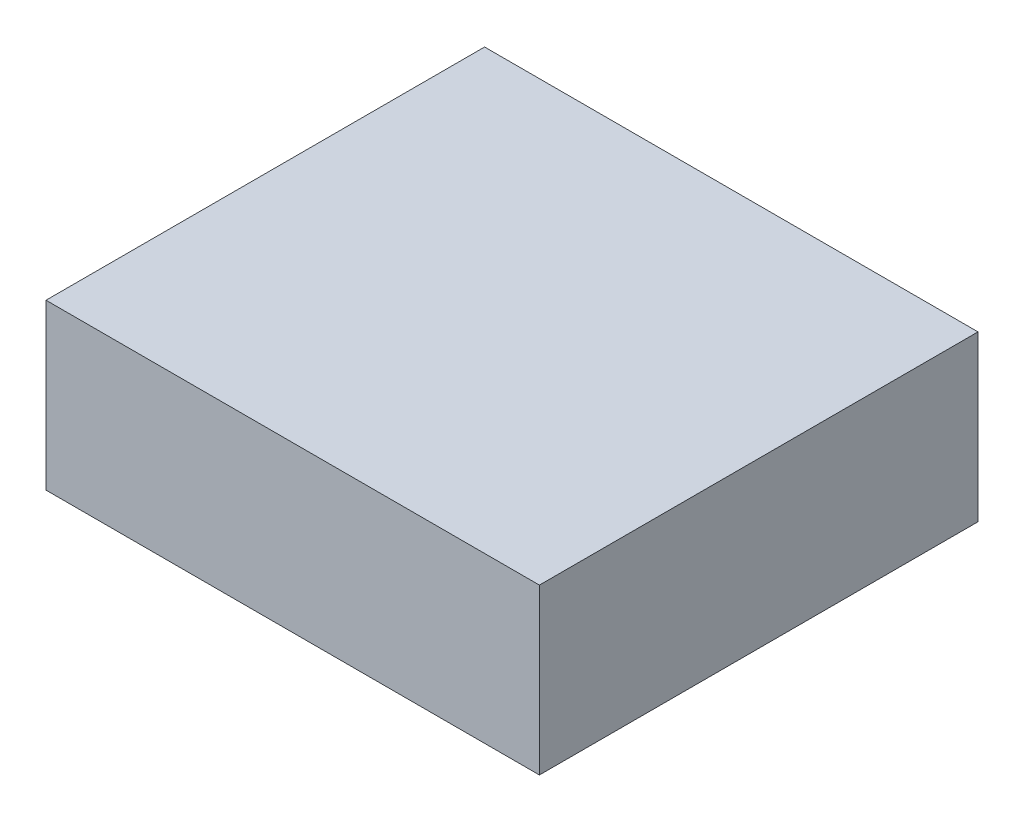
ISO-10303-21;
HEADER;
FILE_DESCRIPTION(('STEP AP214'),'2;1');
FILE_NAME('part.step','',(''),(''),'','','');
FILE_SCHEMA(('AUTOMOTIVE_DESIGN { 1 0 10303 214 1 1 1 1 }'));
ENDSEC;
DATA;
#1=APPLICATION_CONTEXT('core data for automotive mechanical design processes');
#2=APPLICATION_PROTOCOL_DEFINITION('international standard','automotive_design',2000,#1);
#3=PRODUCT_CONTEXT('',#1,'mechanical');
#4=PRODUCT('Part','Part','',(#3));
#5=PRODUCT_RELATED_PRODUCT_CATEGORY('part','',(#4));
#6=PRODUCT_DEFINITION_FORMATION('','',#4);
#7=PRODUCT_DEFINITION_CONTEXT('part definition',#1,'design');
#8=PRODUCT_DEFINITION('design','',#6,#7);
#9=PRODUCT_DEFINITION_SHAPE('','',#8);
#10=(LENGTH_UNIT() NAMED_UNIT(*) SI_UNIT(.MILLI.,.METRE.));
#11=(NAMED_UNIT(*) PLANE_ANGLE_UNIT() SI_UNIT($,.RADIAN.));
#12=(NAMED_UNIT(*) SI_UNIT($,.STERADIAN.) SOLID_ANGLE_UNIT());
#13=UNCERTAINTY_MEASURE_WITH_UNIT(LENGTH_MEASURE(1.E-05),#10,'distance_accuracy_value','');
#14=(GEOMETRIC_REPRESENTATION_CONTEXT(3) GLOBAL_UNCERTAINTY_ASSIGNED_CONTEXT((#13)) GLOBAL_UNIT_ASSIGNED_CONTEXT((#10,
#11,#12)) REPRESENTATION_CONTEXT('',''));
#15=CARTESIAN_POINT('',(0.,0.,0.));
#16=DIRECTION('',(0.,0.,1.));
#17=DIRECTION('',(1.,0.,0.));
#18=AXIS2_PLACEMENT_3D('',#15,#16,#17);
#19=CARTESIAN_POINT('',(-850.,-230.,2040.));
#20=DIRECTION('',(1.,0.,0.));
#21=DIRECTION('',(0.,0.,-1.));
#22=AXIS2_PLACEMENT_3D('',#19,#20,#21);
#23=PLANE('',#22);
#24=DIRECTION('',(0.,-1.,0.));
#25=VECTOR('',#24,1.);
#26=CARTESIAN_POINT('',(-850.,-230.,1240.));
#27=LINE('',#26,#25);
#28=CARTESIAN_POINT('',(-850.,69.9999999999999,1240.));
#29=VERTEX_POINT('',#28);
#30=CARTESIAN_POINT('',(-850.,-230.,1240.));
#31=VERTEX_POINT('',#30);
#32=EDGE_CURVE('E105',#29,#31,#27,.T.);
#33=ORIENTED_EDGE('',*,*,#32,.T.);
#34=DIRECTION('',(0.,0.,-1.));
#35=VECTOR('',#34,1.);
#36=CARTESIAN_POINT('',(-850.,-230.,2040.));
#37=LINE('',#36,#35);
#38=CARTESIAN_POINT('',(-850.,-230.,2040.));
#39=VERTEX_POINT('',#38);
#40=EDGE_CURVE('E11',#39,#31,#37,.T.);
#41=ORIENTED_EDGE('',*,*,#40,.F.);
#42=DIRECTION('',(0.,-1.,0.));
#43=VECTOR('',#42,1.);
#44=CARTESIAN_POINT('',(-850.,-230.,2040.));
#45=LINE('',#44,#43);
#46=CARTESIAN_POINT('',(-850.,69.9999999999999,2040.));
#47=VERTEX_POINT('',#46);
#48=EDGE_CURVE('E89',#47,#39,#45,.T.);
#49=ORIENTED_EDGE('',*,*,#48,.F.);
#50=DIRECTION('',(0.,0.,-1.));
#51=VECTOR('',#50,1.);
#52=CARTESIAN_POINT('',(-850.,69.9999999999999,2040.));
#53=LINE('',#52,#51);
#54=EDGE_CURVE('E98',#47,#29,#53,.T.);
#55=ORIENTED_EDGE('',*,*,#54,.T.);
#56=EDGE_LOOP('',(#33,#41,#49,#55));
#57=FACE_BOUND('',#56,.T.);
#58=ADVANCED_FACE('F39',(#57),#23,.F.);
#59=CARTESIAN_POINT('',(-850.,-230.,2040.));
#60=DIRECTION('',(0.,1.,0.));
#61=DIRECTION('',(0.,0.,1.));
#62=AXIS2_PLACEMENT_3D('',#59,#60,#61);
#63=PLANE('',#62);
#64=DIRECTION('',(1.,0.,0.));
#65=VECTOR('',#64,1.);
#66=CARTESIAN_POINT('',(-850.,-230.,1240.));
#67=LINE('',#66,#65);
#68=CARTESIAN_POINT('',(50.,-230.,1240.));
#69=VERTEX_POINT('',#68);
#70=EDGE_CURVE('E94',#31,#69,#67,.T.);
#71=ORIENTED_EDGE('',*,*,#70,.T.);
#72=DIRECTION('',(0.,0.,-1.));
#73=VECTOR('',#72,1.);
#74=CARTESIAN_POINT('',(50.,-230.,2040.));
#75=LINE('',#74,#73);
#76=CARTESIAN_POINT('',(50.,-230.,2040.));
#77=VERTEX_POINT('',#76);
#78=EDGE_CURVE('E50',#77,#69,#75,.T.);
#79=ORIENTED_EDGE('',*,*,#78,.F.);
#80=DIRECTION('',(1.,0.,0.));
#81=VECTOR('',#80,1.);
#82=CARTESIAN_POINT('',(-850.,-230.,2040.));
#83=LINE('',#82,#81);
#84=EDGE_CURVE('E83',#39,#77,#83,.T.);
#85=ORIENTED_EDGE('',*,*,#84,.F.);
#86=ORIENTED_EDGE('',*,*,#40,.T.);
#87=EDGE_LOOP('',(#71,#79,#85,#86));
#88=FACE_BOUND('',#87,.T.);
#89=ADVANCED_FACE('F91',(#88),#63,.F.);
#90=CARTESIAN_POINT('',(50.,-230.,2040.));
#91=DIRECTION('',(-1.,0.,0.));
#92=DIRECTION('',(0.,0.,1.));
#93=AXIS2_PLACEMENT_3D('',#90,#91,#92);
#94=PLANE('',#93);
#95=DIRECTION('',(0.,1.,0.));
#96=VECTOR('',#95,1.);
#97=CARTESIAN_POINT('',(50.,-230.,1240.));
#98=LINE('',#97,#96);
#99=CARTESIAN_POINT('',(50.,69.9999999999999,1240.));
#100=VERTEX_POINT('',#99);
#101=EDGE_CURVE('E75',#69,#100,#98,.T.);
#102=ORIENTED_EDGE('',*,*,#101,.T.);
#103=DIRECTION('',(0.,0.,-1.));
#104=VECTOR('',#103,1.);
#105=CARTESIAN_POINT('',(50.,69.9999999999999,2040.));
#106=LINE('',#105,#104);
#107=CARTESIAN_POINT('',(50.,69.9999999999999,2040.));
#108=VERTEX_POINT('',#107);
#109=EDGE_CURVE('E92',#108,#100,#106,.T.);
#110=ORIENTED_EDGE('',*,*,#109,.F.);
#111=DIRECTION('',(0.,1.,0.));
#112=VECTOR('',#111,1.);
#113=CARTESIAN_POINT('',(50.,-230.,2040.));
#114=LINE('',#113,#112);
#115=EDGE_CURVE('E86',#77,#108,#114,.T.);
#116=ORIENTED_EDGE('',*,*,#115,.F.);
#117=ORIENTED_EDGE('',*,*,#78,.T.);
#118=EDGE_LOOP('',(#102,#110,#116,#117));
#119=FACE_BOUND('',#118,.T.);
#120=ADVANCED_FACE('F96',(#119),#94,.F.);
#121=CARTESIAN_POINT('',(-850.,69.9999999999999,2040.));
#122=DIRECTION('',(0.,-1.,0.));
#123=DIRECTION('',(0.,0.,-1.));
#124=AXIS2_PLACEMENT_3D('',#121,#122,#123);
#125=PLANE('',#124);
#126=DIRECTION('',(-1.,0.,0.));
#127=VECTOR('',#126,1.);
#128=CARTESIAN_POINT('',(-850.,69.9999999999999,1240.));
#129=LINE('',#128,#127);
#130=EDGE_CURVE('E79',#100,#29,#129,.T.);
#131=ORIENTED_EDGE('',*,*,#130,.T.);
#132=ORIENTED_EDGE('',*,*,#54,.F.);
#133=DIRECTION('',(-1.,0.,0.));
#134=VECTOR('',#133,1.);
#135=CARTESIAN_POINT('',(-850.,69.9999999999999,2040.));
#136=LINE('',#135,#134);
#137=EDGE_CURVE('E54',#108,#47,#136,.T.);
#138=ORIENTED_EDGE('',*,*,#137,.F.);
#139=ORIENTED_EDGE('',*,*,#109,.T.);
#140=EDGE_LOOP('',(#131,#132,#138,#139));
#141=FACE_BOUND('',#140,.T.);
#142=ADVANCED_FACE('F108',(#141),#125,.F.);
#143=CARTESIAN_POINT('',(0.,0.,2040.));
#144=DIRECTION('',(0.,0.,-1.));
#145=DIRECTION('',(-1.,0.,0.));
#146=AXIS2_PLACEMENT_3D('',#143,#144,#145);
#147=PLANE('',#146);
#148=ORIENTED_EDGE('',*,*,#48,.T.);
#149=ORIENTED_EDGE('',*,*,#84,.T.);
#150=ORIENTED_EDGE('',*,*,#115,.T.);
#151=ORIENTED_EDGE('',*,*,#137,.T.);
#152=EDGE_LOOP('',(#148,#149,#150,#151));
#153=FACE_BOUND('',#152,.T.);
#154=ADVANCED_FACE('F88',(#153),#147,.F.);
#155=CARTESIAN_POINT('',(0.,0.,1240.));
#156=DIRECTION('',(0.,0.,-1.));
#157=DIRECTION('',(-1.,0.,0.));
#158=AXIS2_PLACEMENT_3D('',#155,#156,#157);
#159=PLANE('',#158);
#160=ORIENTED_EDGE('',*,*,#32,.F.);
#161=ORIENTED_EDGE('',*,*,#130,.F.);
#162=ORIENTED_EDGE('',*,*,#101,.F.);
#163=ORIENTED_EDGE('',*,*,#70,.F.);
#164=EDGE_LOOP('',(#160,#161,#162,#163));
#165=FACE_BOUND('',#164,.T.);
#166=ADVANCED_FACE('F115',(#165),#159,.T.);
#167=CLOSED_SHELL('',(#58,#89,#120,#142,#154,#166));
#168=MANIFOLD_SOLID_BREP('B2',#167);
#169=ADVANCED_BREP_SHAPE_REPRESENTATION('',(#18,#168),#14);
#170=SHAPE_DEFINITION_REPRESENTATION(#9,#169);
ENDSEC;
END-ISO-10303-21;
